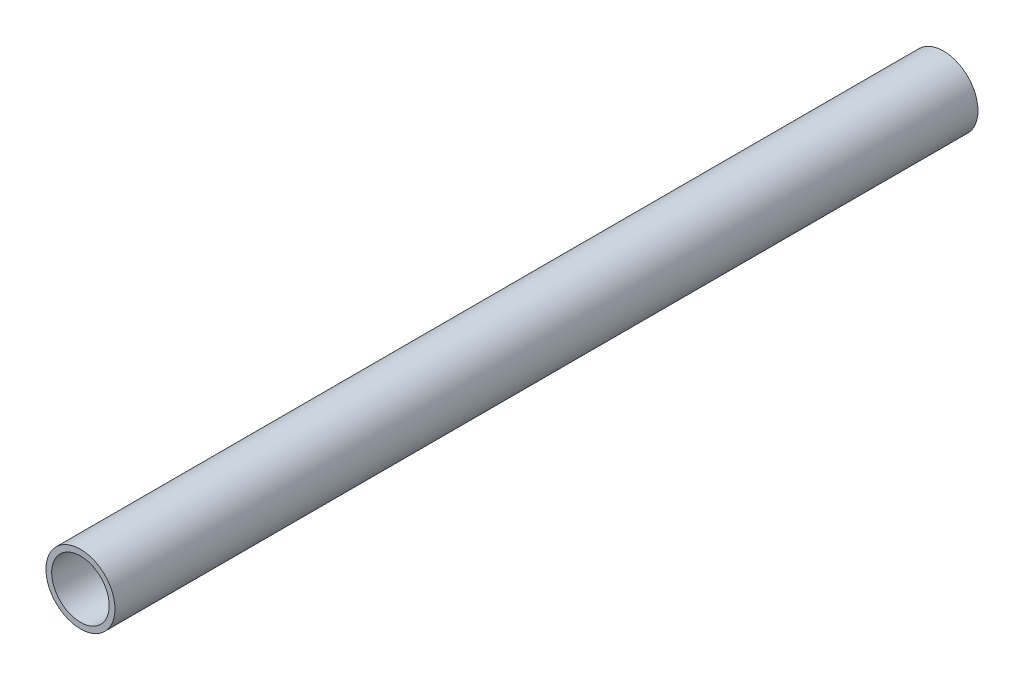
ISO-10303-21;
HEADER;
FILE_DESCRIPTION(('STEP AP214'),'2;1');
FILE_NAME('part.step','',(''),(''),'','','');
FILE_SCHEMA(('AUTOMOTIVE_DESIGN { 1 0 10303 214 1 1 1 1 }'));
ENDSEC;
DATA;
#1=APPLICATION_CONTEXT('core data for automotive mechanical design processes');
#2=APPLICATION_PROTOCOL_DEFINITION('international standard','automotive_design',2000,#1);
#3=PRODUCT_CONTEXT('',#1,'mechanical');
#4=PRODUCT('Part','Part','',(#3));
#5=PRODUCT_RELATED_PRODUCT_CATEGORY('part','',(#4));
#6=PRODUCT_DEFINITION_FORMATION('','',#4);
#7=PRODUCT_DEFINITION_CONTEXT('part definition',#1,'design');
#8=PRODUCT_DEFINITION('design','',#6,#7);
#9=PRODUCT_DEFINITION_SHAPE('','',#8);
#10=(LENGTH_UNIT() NAMED_UNIT(*) SI_UNIT(.MILLI.,.METRE.));
#11=(NAMED_UNIT(*) PLANE_ANGLE_UNIT() SI_UNIT($,.RADIAN.));
#12=(NAMED_UNIT(*) SI_UNIT($,.STERADIAN.) SOLID_ANGLE_UNIT());
#13=UNCERTAINTY_MEASURE_WITH_UNIT(LENGTH_MEASURE(1.E-05),#10,'distance_accuracy_value','');
#14=(GEOMETRIC_REPRESENTATION_CONTEXT(3) GLOBAL_UNCERTAINTY_ASSIGNED_CONTEXT((#13)) GLOBAL_UNIT_ASSIGNED_CONTEXT((#10,
#11,#12)) REPRESENTATION_CONTEXT('',''));
#15=CARTESIAN_POINT('',(0.,0.,0.));
#16=DIRECTION('',(0.,0.,1.));
#17=DIRECTION('',(1.,0.,0.));
#18=AXIS2_PLACEMENT_3D('',#15,#16,#17);
#19=CARTESIAN_POINT('',(0.,0.,75.));
#20=DIRECTION('',(0.,0.,1.));
#21=DIRECTION('',(1.,0.,0.));
#22=AXIS2_PLACEMENT_3D('',#19,#20,#21);
#23=PLANE('',#22);
#24=CARTESIAN_POINT('',(0.,0.,75.));
#25=DIRECTION('',(0.,0.,1.));
#26=DIRECTION('',(1.,0.,0.));
#27=AXIS2_PLACEMENT_3D('',#24,#25,#26);
#28=CIRCLE('',#27,6.);
#29=CARTESIAN_POINT('',(6.,0.,75.));
#30=VERTEX_POINT('',#29);
#31=EDGE_CURVE('E10',#30,#30,#28,.T.);
#32=ORIENTED_EDGE('',*,*,#31,.T.);
#33=EDGE_LOOP('',(#32));
#34=FACE_BOUND('',#33,.T.);
#35=CARTESIAN_POINT('',(0.,0.,75.));
#36=DIRECTION('',(0.,0.,1.));
#37=DIRECTION('',(1.,0.,0.));
#38=AXIS2_PLACEMENT_3D('',#35,#36,#37);
#39=CIRCLE('',#38,5.);
#40=CARTESIAN_POINT('',(5.,0.,75.));
#41=VERTEX_POINT('',#40);
#42=EDGE_CURVE('E44',#41,#41,#39,.T.);
#43=ORIENTED_EDGE('',*,*,#42,.F.);
#44=EDGE_LOOP('',(#43));
#45=FACE_BOUND('',#44,.T.);
#46=ADVANCED_FACE('F33',(#34,#45),#23,.T.);
#47=CARTESIAN_POINT('',(0.,0.,-75.));
#48=DIRECTION('',(0.,0.,1.));
#49=DIRECTION('',(1.,0.,0.));
#50=AXIS2_PLACEMENT_3D('',#47,#48,#49);
#51=PLANE('',#50);
#52=CARTESIAN_POINT('',(0.,0.,-75.));
#53=DIRECTION('',(0.,0.,1.));
#54=DIRECTION('',(1.,0.,0.));
#55=AXIS2_PLACEMENT_3D('',#52,#53,#54);
#56=CIRCLE('',#55,6.);
#57=CARTESIAN_POINT('',(6.,0.,-75.));
#58=VERTEX_POINT('',#57);
#59=EDGE_CURVE('E37',#58,#58,#56,.T.);
#60=ORIENTED_EDGE('',*,*,#59,.F.);
#61=EDGE_LOOP('',(#60));
#62=FACE_BOUND('',#61,.T.);
#63=CARTESIAN_POINT('',(0.,0.,-75.));
#64=DIRECTION('',(0.,0.,1.));
#65=DIRECTION('',(1.,0.,0.));
#66=AXIS2_PLACEMENT_3D('',#63,#64,#65);
#67=CIRCLE('',#66,5.);
#68=CARTESIAN_POINT('',(5.,0.,-75.));
#69=VERTEX_POINT('',#68);
#70=EDGE_CURVE('E46',#69,#69,#67,.T.);
#71=ORIENTED_EDGE('',*,*,#70,.T.);
#72=EDGE_LOOP('',(#71));
#73=FACE_BOUND('',#72,.T.);
#74=ADVANCED_FACE('F56',(#62,#73),#51,.F.);
#75=CARTESIAN_POINT('',(0.,0.,75.));
#76=DIRECTION('',(0.,0.,-1.));
#77=DIRECTION('',(-1.,0.,0.));
#78=AXIS2_PLACEMENT_3D('',#75,#76,#77);
#79=CYLINDRICAL_SURFACE('',#78,6.);
#80=ORIENTED_EDGE('',*,*,#31,.F.);
#81=EDGE_LOOP('',(#80));
#82=FACE_BOUND('',#81,.T.);
#83=ORIENTED_EDGE('',*,*,#59,.T.);
#84=EDGE_LOOP('',(#83));
#85=FACE_BOUND('',#84,.T.);
#86=ADVANCED_FACE('F35',(#82,#85),#79,.T.);
#87=CARTESIAN_POINT('',(0.,0.,75.));
#88=DIRECTION('',(0.,0.,-1.));
#89=DIRECTION('',(-1.,0.,0.));
#90=AXIS2_PLACEMENT_3D('',#87,#88,#89);
#91=CYLINDRICAL_SURFACE('',#90,5.);
#92=ORIENTED_EDGE('',*,*,#42,.T.);
#93=EDGE_LOOP('',(#92));
#94=FACE_BOUND('',#93,.T.);
#95=ORIENTED_EDGE('',*,*,#70,.F.);
#96=EDGE_LOOP('',(#95));
#97=FACE_BOUND('',#96,.T.);
#98=ADVANCED_FACE('F52',(#94,#97),#91,.F.);
#99=CLOSED_SHELL('',(#46,#74,#86,#98));
#100=MANIFOLD_SOLID_BREP('B2',#99);
#101=ADVANCED_BREP_SHAPE_REPRESENTATION('',(#18,#100),#14);
#102=SHAPE_DEFINITION_REPRESENTATION(#9,#101);
ENDSEC;
END-ISO-10303-21;
